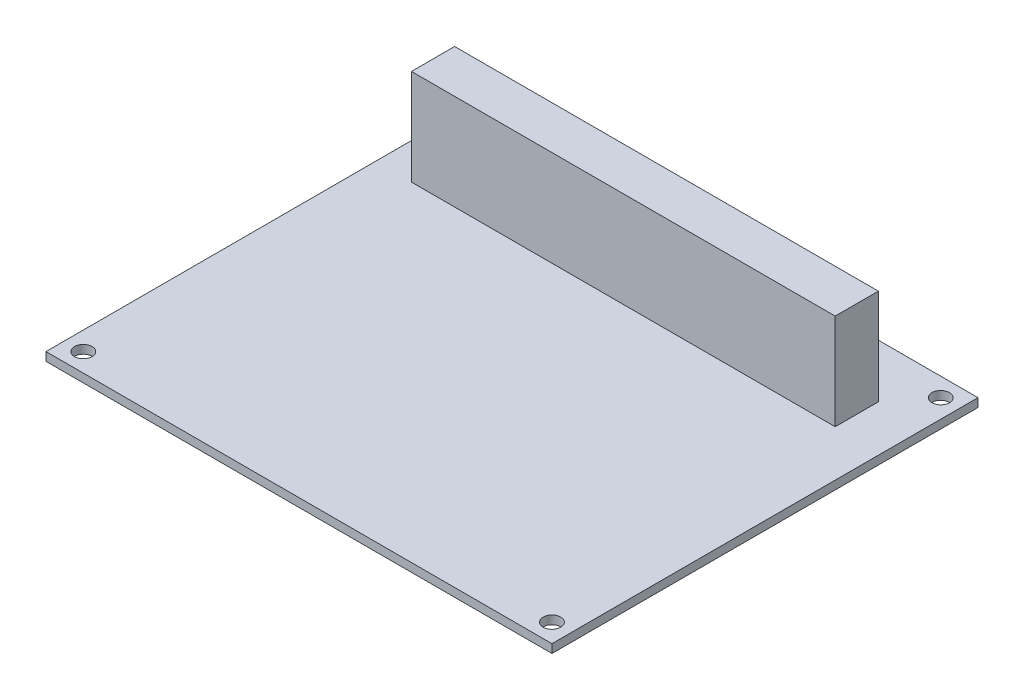
ISO-10303-21;
HEADER;
FILE_DESCRIPTION(('STEP AP214'),'2;1');
FILE_NAME('part.step','',(''),(''),'','','');
FILE_SCHEMA(('AUTOMOTIVE_DESIGN { 1 0 10303 214 1 1 1 1 }'));
ENDSEC;
DATA;
#1=APPLICATION_CONTEXT('core data for automotive mechanical design processes');
#2=APPLICATION_PROTOCOL_DEFINITION('international standard','automotive_design',2000,#1);
#3=PRODUCT_CONTEXT('',#1,'mechanical');
#4=PRODUCT('Part','Part','',(#3));
#5=PRODUCT_RELATED_PRODUCT_CATEGORY('part','',(#4));
#6=PRODUCT_DEFINITION_FORMATION('','',#4);
#7=PRODUCT_DEFINITION_CONTEXT('part definition',#1,'design');
#8=PRODUCT_DEFINITION('design','',#6,#7);
#9=PRODUCT_DEFINITION_SHAPE('','',#8);
#10=(LENGTH_UNIT() NAMED_UNIT(*) SI_UNIT(.MILLI.,.METRE.));
#11=(NAMED_UNIT(*) PLANE_ANGLE_UNIT() SI_UNIT($,.RADIAN.));
#12=(NAMED_UNIT(*) SI_UNIT($,.STERADIAN.) SOLID_ANGLE_UNIT());
#13=UNCERTAINTY_MEASURE_WITH_UNIT(LENGTH_MEASURE(1.E-05),#10,'distance_accuracy_value','');
#14=(GEOMETRIC_REPRESENTATION_CONTEXT(3) GLOBAL_UNCERTAINTY_ASSIGNED_CONTEXT((#13)) GLOBAL_UNIT_ASSIGNED_CONTEXT((#10,
#11,#12)) REPRESENTATION_CONTEXT('',''));
#15=CARTESIAN_POINT('',(0.,0.,0.));
#16=DIRECTION('',(0.,0.,1.));
#17=DIRECTION('',(1.,0.,0.));
#18=AXIS2_PLACEMENT_3D('',#15,#16,#17);
#19=CARTESIAN_POINT('',(0.,1.6,0.));
#20=DIRECTION('',(0.,1.,0.));
#21=DIRECTION('',(0.,0.,1.));
#22=AXIS2_PLACEMENT_3D('',#19,#20,#21);
#23=PLANE('',#22);
#24=CARTESIAN_POINT('',(44.,1.6,36.5));
#25=DIRECTION('',(0.,1.,0.));
#26=DIRECTION('',(0.,0.,1.));
#27=AXIS2_PLACEMENT_3D('',#24,#25,#26);
#28=CIRCLE('',#27,1.65);
#29=CARTESIAN_POINT('',(44.,1.6,38.15));
#30=VERTEX_POINT('',#29);
#31=EDGE_CURVE('E127',#30,#30,#28,.T.);
#32=ORIENTED_EDGE('',*,*,#31,.F.);
#33=EDGE_LOOP('',(#32));
#34=FACE_BOUND('',#33,.T.);
#35=CARTESIAN_POINT('',(-44.,1.6,-36.5));
#36=DIRECTION('',(0.,1.,0.));
#37=DIRECTION('',(0.,0.,1.));
#38=AXIS2_PLACEMENT_3D('',#35,#36,#37);
#39=CIRCLE('',#38,1.65);
#40=CARTESIAN_POINT('',(-44.,1.6,-34.85));
#41=VERTEX_POINT('',#40);
#42=EDGE_CURVE('E139',#41,#41,#39,.T.);
#43=ORIENTED_EDGE('',*,*,#42,.F.);
#44=EDGE_LOOP('',(#43));
#45=FACE_BOUND('',#44,.T.);
#46=DIRECTION('',(0.,0.,1.));
#47=VECTOR('',#46,1.);
#48=CARTESIAN_POINT('',(-47.5,1.6,40.));
#49=LINE('',#48,#47);
#50=CARTESIAN_POINT('',(-47.5,1.6,-40.));
#51=VERTEX_POINT('',#50);
#52=CARTESIAN_POINT('',(-47.5,1.6,40.));
#53=VERTEX_POINT('',#52);
#54=EDGE_CURVE('E145',#51,#53,#49,.T.);
#55=ORIENTED_EDGE('',*,*,#54,.T.);
#56=DIRECTION('',(1.,0.,0.));
#57=VECTOR('',#56,1.);
#58=CARTESIAN_POINT('',(47.5,1.6,40.));
#59=LINE('',#58,#57);
#60=CARTESIAN_POINT('',(47.5,1.6,40.));
#61=VERTEX_POINT('',#60);
#62=EDGE_CURVE('E69',#53,#61,#59,.T.);
#63=ORIENTED_EDGE('',*,*,#62,.T.);
#64=DIRECTION('',(0.,0.,-1.));
#65=VECTOR('',#64,1.);
#66=CARTESIAN_POINT('',(47.5,1.6,40.));
#67=LINE('',#66,#65);
#68=CARTESIAN_POINT('',(47.5,1.6,-40.));
#69=VERTEX_POINT('',#68);
#70=EDGE_CURVE('E148',#61,#69,#67,.T.);
#71=ORIENTED_EDGE('',*,*,#70,.T.);
#72=DIRECTION('',(-1.,0.,0.));
#73=VECTOR('',#72,1.);
#74=CARTESIAN_POINT('',(47.5,1.6,-40.));
#75=LINE('',#74,#73);
#76=EDGE_CURVE('E41',#69,#51,#75,.T.);
#77=ORIENTED_EDGE('',*,*,#76,.T.);
#78=EDGE_LOOP('',(#55,#63,#71,#77));
#79=FACE_BOUND('',#78,.T.);
#80=CARTESIAN_POINT('',(-44.,1.6,36.5));
#81=DIRECTION('',(0.,1.,0.));
#82=DIRECTION('',(0.,0.,1.));
#83=AXIS2_PLACEMENT_3D('',#80,#81,#82);
#84=CIRCLE('',#83,1.65);
#85=CARTESIAN_POINT('',(-44.,1.6,38.15));
#86=VERTEX_POINT('',#85);
#87=EDGE_CURVE('E133',#86,#86,#84,.T.);
#88=ORIENTED_EDGE('',*,*,#87,.F.);
#89=EDGE_LOOP('',(#88));
#90=FACE_BOUND('',#89,.T.);
#91=CARTESIAN_POINT('',(44.,1.6,-36.5));
#92=DIRECTION('',(0.,1.,0.));
#93=DIRECTION('',(0.,0.,1.));
#94=AXIS2_PLACEMENT_3D('',#91,#92,#93);
#95=CIRCLE('',#94,1.65);
#96=CARTESIAN_POINT('',(44.,1.6,-34.85));
#97=VERTEX_POINT('',#96);
#98=EDGE_CURVE('E119',#97,#97,#95,.T.);
#99=ORIENTED_EDGE('',*,*,#98,.F.);
#100=EDGE_LOOP('',(#99));
#101=FACE_BOUND('',#100,.T.);
#102=DIRECTION('',(1.,0.,0.));
#103=VECTOR('',#102,1.);
#104=CARTESIAN_POINT('',(-40.7410647702607,1.6,-21.8636604133598));
#105=LINE('',#104,#103);
#106=CARTESIAN_POINT('',(-40.7410647702607,1.6,-21.8636604133598));
#107=VERTEX_POINT('',#106);
#108=CARTESIAN_POINT('',(38.8213287339657,1.6,-21.8636604133598));
#109=VERTEX_POINT('',#108);
#110=EDGE_CURVE('E330',#107,#109,#105,.T.);
#111=ORIENTED_EDGE('',*,*,#110,.F.);
#112=DIRECTION('',(0.,0.,1.));
#113=VECTOR('',#112,1.);
#114=CARTESIAN_POINT('',(-40.7410647702607,1.6,-29.9692125666054));
#115=LINE('',#114,#113);
#116=CARTESIAN_POINT('',(-40.7410647702607,1.6,-29.9692125666054));
#117=VERTEX_POINT('',#116);
#118=EDGE_CURVE('E114',#117,#107,#115,.T.);
#119=ORIENTED_EDGE('',*,*,#118,.F.);
#120=DIRECTION('',(-1.,0.,0.));
#121=VECTOR('',#120,1.);
#122=CARTESIAN_POINT('',(-40.7410647702607,1.6,-29.9692125666054));
#123=LINE('',#122,#121);
#124=CARTESIAN_POINT('',(38.8213287339657,1.6,-29.9692125666054));
#125=VERTEX_POINT('',#124);
#126=EDGE_CURVE('E110',#125,#117,#123,.T.);
#127=ORIENTED_EDGE('',*,*,#126,.F.);
#128=DIRECTION('',(0.,0.,-1.));
#129=VECTOR('',#128,1.);
#130=CARTESIAN_POINT('',(38.8213287339657,1.6,-29.9692125666054));
#131=LINE('',#130,#129);
#132=EDGE_CURVE('E327',#109,#125,#131,.T.);
#133=ORIENTED_EDGE('',*,*,#132,.F.);
#134=EDGE_LOOP('',(#111,#119,#127,#133));
#135=FACE_BOUND('',#134,.T.);
#136=ADVANCED_FACE('F17',(#34,#45,#79,#90,#101,#135),#23,.T.);
#137=CARTESIAN_POINT('',(0.,0.,0.));
#138=DIRECTION('',(0.,1.,0.));
#139=DIRECTION('',(0.,0.,1.));
#140=AXIS2_PLACEMENT_3D('',#137,#138,#139);
#141=PLANE('',#140);
#142=DIRECTION('',(0.,0.,1.));
#143=VECTOR('',#142,1.);
#144=CARTESIAN_POINT('',(-47.5,0.,40.));
#145=LINE('',#144,#143);
#146=CARTESIAN_POINT('',(-47.5,0.,-40.));
#147=VERTEX_POINT('',#146);
#148=CARTESIAN_POINT('',(-47.5,0.,40.));
#149=VERTEX_POINT('',#148);
#150=EDGE_CURVE('E142',#147,#149,#145,.T.);
#151=ORIENTED_EDGE('',*,*,#150,.F.);
#152=DIRECTION('',(-1.,0.,0.));
#153=VECTOR('',#152,1.);
#154=CARTESIAN_POINT('',(47.5,0.,-40.));
#155=LINE('',#154,#153);
#156=CARTESIAN_POINT('',(47.5,0.,-40.));
#157=VERTEX_POINT('',#156);
#158=EDGE_CURVE('E62',#157,#147,#155,.T.);
#159=ORIENTED_EDGE('',*,*,#158,.F.);
#160=DIRECTION('',(0.,0.,-1.));
#161=VECTOR('',#160,1.);
#162=CARTESIAN_POINT('',(47.5,0.,40.));
#163=LINE('',#162,#161);
#164=CARTESIAN_POINT('',(47.5,0.,40.));
#165=VERTEX_POINT('',#164);
#166=EDGE_CURVE('E156',#165,#157,#163,.T.);
#167=ORIENTED_EDGE('',*,*,#166,.F.);
#168=DIRECTION('',(1.,0.,0.));
#169=VECTOR('',#168,1.);
#170=CARTESIAN_POINT('',(47.5,0.,40.));
#171=LINE('',#170,#169);
#172=EDGE_CURVE('E154',#149,#165,#171,.T.);
#173=ORIENTED_EDGE('',*,*,#172,.F.);
#174=EDGE_LOOP('',(#151,#159,#167,#173));
#175=FACE_BOUND('',#174,.T.);
#176=CARTESIAN_POINT('',(-44.,0.,-36.5));
#177=DIRECTION('',(0.,1.,0.));
#178=DIRECTION('',(0.,0.,1.));
#179=AXIS2_PLACEMENT_3D('',#176,#177,#178);
#180=CIRCLE('',#179,1.65);
#181=CARTESIAN_POINT('',(-44.,0.,-34.85));
#182=VERTEX_POINT('',#181);
#183=EDGE_CURVE('E136',#182,#182,#180,.T.);
#184=ORIENTED_EDGE('',*,*,#183,.T.);
#185=EDGE_LOOP('',(#184));
#186=FACE_BOUND('',#185,.T.);
#187=CARTESIAN_POINT('',(-44.,0.,36.5));
#188=DIRECTION('',(0.,1.,0.));
#189=DIRECTION('',(0.,0.,1.));
#190=AXIS2_PLACEMENT_3D('',#187,#188,#189);
#191=CIRCLE('',#190,1.65);
#192=CARTESIAN_POINT('',(-44.,0.,38.15));
#193=VERTEX_POINT('',#192);
#194=EDGE_CURVE('E130',#193,#193,#191,.T.);
#195=ORIENTED_EDGE('',*,*,#194,.T.);
#196=EDGE_LOOP('',(#195));
#197=FACE_BOUND('',#196,.T.);
#198=CARTESIAN_POINT('',(44.,0.,36.5));
#199=DIRECTION('',(0.,1.,0.));
#200=DIRECTION('',(0.,0.,1.));
#201=AXIS2_PLACEMENT_3D('',#198,#199,#200);
#202=CIRCLE('',#201,1.65);
#203=CARTESIAN_POINT('',(44.,0.,38.15));
#204=VERTEX_POINT('',#203);
#205=EDGE_CURVE('E125',#204,#204,#202,.T.);
#206=ORIENTED_EDGE('',*,*,#205,.T.);
#207=EDGE_LOOP('',(#206));
#208=FACE_BOUND('',#207,.T.);
#209=CARTESIAN_POINT('',(44.,0.,-36.5));
#210=DIRECTION('',(0.,1.,0.));
#211=DIRECTION('',(0.,0.,1.));
#212=AXIS2_PLACEMENT_3D('',#209,#210,#211);
#213=CIRCLE('',#212,1.65);
#214=CARTESIAN_POINT('',(44.,0.,-34.85));
#215=VERTEX_POINT('',#214);
#216=EDGE_CURVE('E116',#215,#215,#213,.T.);
#217=ORIENTED_EDGE('',*,*,#216,.T.);
#218=EDGE_LOOP('',(#217));
#219=FACE_BOUND('',#218,.T.);
#220=ADVANCED_FACE('F169',(#175,#186,#197,#208,#219),#141,.F.);
#221=CARTESIAN_POINT('',(-47.5,1.6,40.));
#222=DIRECTION('',(1.,0.,0.));
#223=DIRECTION('',(0.,0.,-1.));
#224=AXIS2_PLACEMENT_3D('',#221,#222,#223);
#225=PLANE('',#224);
#226=ORIENTED_EDGE('',*,*,#150,.T.);
#227=DIRECTION('',(0.,-1.,0.));
#228=VECTOR('',#227,1.);
#229=CARTESIAN_POINT('',(-47.5,1.6,40.));
#230=LINE('',#229,#228);
#231=EDGE_CURVE('E11',#53,#149,#230,.T.);
#232=ORIENTED_EDGE('',*,*,#231,.F.);
#233=ORIENTED_EDGE('',*,*,#54,.F.);
#234=DIRECTION('',(0.,-1.,0.));
#235=VECTOR('',#234,1.);
#236=CARTESIAN_POINT('',(-47.5,1.6,-40.));
#237=LINE('',#236,#235);
#238=EDGE_CURVE('E151',#51,#147,#237,.T.);
#239=ORIENTED_EDGE('',*,*,#238,.T.);
#240=EDGE_LOOP('',(#226,#232,#233,#239));
#241=FACE_BOUND('',#240,.T.);
#242=ADVANCED_FACE('F19',(#241),#225,.F.);
#243=CARTESIAN_POINT('',(47.5,1.6,40.));
#244=DIRECTION('',(0.,0.,-1.));
#245=DIRECTION('',(-1.,0.,0.));
#246=AXIS2_PLACEMENT_3D('',#243,#244,#245);
#247=PLANE('',#246);
#248=ORIENTED_EDGE('',*,*,#172,.T.);
#249=DIRECTION('',(0.,-1.,0.));
#250=VECTOR('',#249,1.);
#251=CARTESIAN_POINT('',(47.5,1.6,40.));
#252=LINE('',#251,#250);
#253=EDGE_CURVE('E25',#61,#165,#252,.T.);
#254=ORIENTED_EDGE('',*,*,#253,.F.);
#255=ORIENTED_EDGE('',*,*,#62,.F.);
#256=ORIENTED_EDGE('',*,*,#231,.T.);
#257=EDGE_LOOP('',(#248,#254,#255,#256));
#258=FACE_BOUND('',#257,.T.);
#259=ADVANCED_FACE('F187',(#258),#247,.F.);
#260=CARTESIAN_POINT('',(47.5,1.6,40.));
#261=DIRECTION('',(-1.,0.,0.));
#262=DIRECTION('',(0.,0.,1.));
#263=AXIS2_PLACEMENT_3D('',#260,#261,#262);
#264=PLANE('',#263);
#265=ORIENTED_EDGE('',*,*,#166,.T.);
#266=DIRECTION('',(0.,-1.,0.));
#267=VECTOR('',#266,1.);
#268=CARTESIAN_POINT('',(47.5,1.6,-40.));
#269=LINE('',#268,#267);
#270=EDGE_CURVE('E160',#69,#157,#269,.T.);
#271=ORIENTED_EDGE('',*,*,#270,.F.);
#272=ORIENTED_EDGE('',*,*,#70,.F.);
#273=ORIENTED_EDGE('',*,*,#253,.T.);
#274=EDGE_LOOP('',(#265,#271,#272,#273));
#275=FACE_BOUND('',#274,.T.);
#276=ADVANCED_FACE('F165',(#275),#264,.F.);
#277=CARTESIAN_POINT('',(47.5,1.6,-40.));
#278=DIRECTION('',(0.,0.,1.));
#279=DIRECTION('',(1.,0.,0.));
#280=AXIS2_PLACEMENT_3D('',#277,#278,#279);
#281=PLANE('',#280);
#282=ORIENTED_EDGE('',*,*,#158,.T.);
#283=ORIENTED_EDGE('',*,*,#238,.F.);
#284=ORIENTED_EDGE('',*,*,#76,.F.);
#285=ORIENTED_EDGE('',*,*,#270,.T.);
#286=EDGE_LOOP('',(#282,#283,#284,#285));
#287=FACE_BOUND('',#286,.T.);
#288=ADVANCED_FACE('F174',(#287),#281,.F.);
#289=CARTESIAN_POINT('',(-44.,1.6,-36.5));
#290=DIRECTION('',(0.,-1.,0.));
#291=DIRECTION('',(0.,0.,-1.));
#292=AXIS2_PLACEMENT_3D('',#289,#290,#291);
#293=CYLINDRICAL_SURFACE('',#292,1.65);
#294=ORIENTED_EDGE('',*,*,#42,.T.);
#295=EDGE_LOOP('',(#294));
#296=FACE_BOUND('',#295,.T.);
#297=ORIENTED_EDGE('',*,*,#183,.F.);
#298=EDGE_LOOP('',(#297));
#299=FACE_BOUND('',#298,.T.);
#300=ADVANCED_FACE('F176',(#296,#299),#293,.F.);
#301=CARTESIAN_POINT('',(-44.,1.6,36.5));
#302=DIRECTION('',(0.,-1.,0.));
#303=DIRECTION('',(0.,0.,-1.));
#304=AXIS2_PLACEMENT_3D('',#301,#302,#303);
#305=CYLINDRICAL_SURFACE('',#304,1.65);
#306=ORIENTED_EDGE('',*,*,#87,.T.);
#307=EDGE_LOOP('',(#306));
#308=FACE_BOUND('',#307,.T.);
#309=ORIENTED_EDGE('',*,*,#194,.F.);
#310=EDGE_LOOP('',(#309));
#311=FACE_BOUND('',#310,.T.);
#312=ADVANCED_FACE('F184',(#308,#311),#305,.F.);
#313=CARTESIAN_POINT('',(44.,1.6,36.5));
#314=DIRECTION('',(0.,-1.,0.));
#315=DIRECTION('',(0.,0.,-1.));
#316=AXIS2_PLACEMENT_3D('',#313,#314,#315);
#317=CYLINDRICAL_SURFACE('',#316,1.65);
#318=ORIENTED_EDGE('',*,*,#31,.T.);
#319=EDGE_LOOP('',(#318));
#320=FACE_BOUND('',#319,.T.);
#321=ORIENTED_EDGE('',*,*,#205,.F.);
#322=EDGE_LOOP('',(#321));
#323=FACE_BOUND('',#322,.T.);
#324=ADVANCED_FACE('F203',(#320,#323),#317,.F.);
#325=CARTESIAN_POINT('',(44.,1.6,-36.5));
#326=DIRECTION('',(0.,-1.,0.));
#327=DIRECTION('',(0.,0.,-1.));
#328=AXIS2_PLACEMENT_3D('',#325,#326,#327);
#329=CYLINDRICAL_SURFACE('',#328,1.65);
#330=ORIENTED_EDGE('',*,*,#98,.T.);
#331=EDGE_LOOP('',(#330));
#332=FACE_BOUND('',#331,.T.);
#333=ORIENTED_EDGE('',*,*,#216,.F.);
#334=EDGE_LOOP('',(#333));
#335=FACE_BOUND('',#334,.T.);
#336=ADVANCED_FACE('F207',(#332,#335),#329,.F.);
#337=CARTESIAN_POINT('',(-40.7410647702607,19.6,-29.9692125666054));
#338=DIRECTION('',(1.,0.,0.));
#339=DIRECTION('',(0.,0.,-1.));
#340=AXIS2_PLACEMENT_3D('',#337,#338,#339);
#341=PLANE('',#340);
#342=ORIENTED_EDGE('',*,*,#118,.T.);
#343=DIRECTION('',(0.,-1.,0.));
#344=VECTOR('',#343,1.);
#345=CARTESIAN_POINT('',(-40.7410647702607,19.6,-21.8636604133598));
#346=LINE('',#345,#344);
#347=CARTESIAN_POINT('',(-40.7410647702607,19.6,-21.8636604133598));
#348=VERTEX_POINT('',#347);
#349=EDGE_CURVE('E95',#348,#107,#346,.T.);
#350=ORIENTED_EDGE('',*,*,#349,.F.);
#351=DIRECTION('',(0.,0.,1.));
#352=VECTOR('',#351,1.);
#353=CARTESIAN_POINT('',(-40.7410647702607,19.6,-29.9692125666054));
#354=LINE('',#353,#352);
#355=CARTESIAN_POINT('',(-40.7410647702607,19.6,-29.9692125666054));
#356=VERTEX_POINT('',#355);
#357=EDGE_CURVE('E102',#356,#348,#354,.T.);
#358=ORIENTED_EDGE('',*,*,#357,.F.);
#359=DIRECTION('',(0.,-1.,0.));
#360=VECTOR('',#359,1.);
#361=CARTESIAN_POINT('',(-40.7410647702607,19.6,-29.9692125666054));
#362=LINE('',#361,#360);
#363=EDGE_CURVE('E324',#356,#117,#362,.T.);
#364=ORIENTED_EDGE('',*,*,#363,.T.);
#365=EDGE_LOOP('',(#342,#350,#358,#364));
#366=FACE_BOUND('',#365,.T.);
#367=ADVANCED_FACE('F112',(#366),#341,.F.);
#368=CARTESIAN_POINT('',(-40.7410647702607,19.6,-21.8636604133598));
#369=DIRECTION('',(0.,0.,-1.));
#370=DIRECTION('',(-1.,0.,0.));
#371=AXIS2_PLACEMENT_3D('',#368,#369,#370);
#372=PLANE('',#371);
#373=ORIENTED_EDGE('',*,*,#110,.T.);
#374=DIRECTION('',(0.,-1.,0.));
#375=VECTOR('',#374,1.);
#376=CARTESIAN_POINT('',(38.8213287339657,19.6,-21.8636604133598));
#377=LINE('',#376,#375);
#378=CARTESIAN_POINT('',(38.8213287339657,19.6,-21.8636604133598));
#379=VERTEX_POINT('',#378);
#380=EDGE_CURVE('E98',#379,#109,#377,.T.);
#381=ORIENTED_EDGE('',*,*,#380,.F.);
#382=DIRECTION('',(1.,0.,0.));
#383=VECTOR('',#382,1.);
#384=CARTESIAN_POINT('',(-40.7410647702607,19.6,-21.8636604133598));
#385=LINE('',#384,#383);
#386=EDGE_CURVE('E91',#348,#379,#385,.T.);
#387=ORIENTED_EDGE('',*,*,#386,.F.);
#388=ORIENTED_EDGE('',*,*,#349,.T.);
#389=EDGE_LOOP('',(#373,#381,#387,#388));
#390=FACE_BOUND('',#389,.T.);
#391=ADVANCED_FACE('F93',(#390),#372,.F.);
#392=CARTESIAN_POINT('',(38.8213287339657,19.6,-29.9692125666054));
#393=DIRECTION('',(-1.,0.,0.));
#394=DIRECTION('',(0.,0.,1.));
#395=AXIS2_PLACEMENT_3D('',#392,#393,#394);
#396=PLANE('',#395);
#397=ORIENTED_EDGE('',*,*,#132,.T.);
#398=DIRECTION('',(0.,-1.,0.));
#399=VECTOR('',#398,1.);
#400=CARTESIAN_POINT('',(38.8213287339657,19.6,-29.9692125666054));
#401=LINE('',#400,#399);
#402=CARTESIAN_POINT('',(38.8213287339657,19.6,-29.9692125666054));
#403=VERTEX_POINT('',#402);
#404=EDGE_CURVE('E32',#403,#125,#401,.T.);
#405=ORIENTED_EDGE('',*,*,#404,.F.);
#406=DIRECTION('',(0.,0.,-1.));
#407=VECTOR('',#406,1.);
#408=CARTESIAN_POINT('',(38.8213287339657,19.6,-29.9692125666054));
#409=LINE('',#408,#407);
#410=EDGE_CURVE('E101',#379,#403,#409,.T.);
#411=ORIENTED_EDGE('',*,*,#410,.F.);
#412=ORIENTED_EDGE('',*,*,#380,.T.);
#413=EDGE_LOOP('',(#397,#405,#411,#412));
#414=FACE_BOUND('',#413,.T.);
#415=ADVANCED_FACE('F216',(#414),#396,.F.);
#416=CARTESIAN_POINT('',(-40.7410647702607,19.6,-29.9692125666054));
#417=DIRECTION('',(0.,0.,1.));
#418=DIRECTION('',(1.,0.,0.));
#419=AXIS2_PLACEMENT_3D('',#416,#417,#418);
#420=PLANE('',#419);
#421=ORIENTED_EDGE('',*,*,#126,.T.);
#422=ORIENTED_EDGE('',*,*,#363,.F.);
#423=DIRECTION('',(-1.,0.,0.));
#424=VECTOR('',#423,1.);
#425=CARTESIAN_POINT('',(-40.7410647702607,19.6,-29.9692125666054));
#426=LINE('',#425,#424);
#427=EDGE_CURVE('E106',#403,#356,#426,.T.);
#428=ORIENTED_EDGE('',*,*,#427,.F.);
#429=ORIENTED_EDGE('',*,*,#404,.T.);
#430=EDGE_LOOP('',(#421,#422,#428,#429));
#431=FACE_BOUND('',#430,.T.);
#432=ADVANCED_FACE('F219',(#431),#420,.F.);
#433=CARTESIAN_POINT('',(0.,19.6,0.));
#434=DIRECTION('',(0.,1.,0.));
#435=DIRECTION('',(0.,0.,1.));
#436=AXIS2_PLACEMENT_3D('',#433,#434,#435);
#437=PLANE('',#436);
#438=ORIENTED_EDGE('',*,*,#357,.T.);
#439=ORIENTED_EDGE('',*,*,#386,.T.);
#440=ORIENTED_EDGE('',*,*,#410,.T.);
#441=ORIENTED_EDGE('',*,*,#427,.T.);
#442=EDGE_LOOP('',(#438,#439,#440,#441));
#443=FACE_BOUND('',#442,.T.);
#444=ADVANCED_FACE('F105',(#443),#437,.T.);
#445=CLOSED_SHELL('',(#136,#220,#242,#259,#276,#288,#300,#312,#324,#336,#367,#391,#415,#432,#444));
#446=MANIFOLD_SOLID_BREP('B1',#445);
#447=ADVANCED_BREP_SHAPE_REPRESENTATION('',(#18,#446),#14);
#448=SHAPE_DEFINITION_REPRESENTATION(#9,#447);
ENDSEC;
END-ISO-10303-21;
